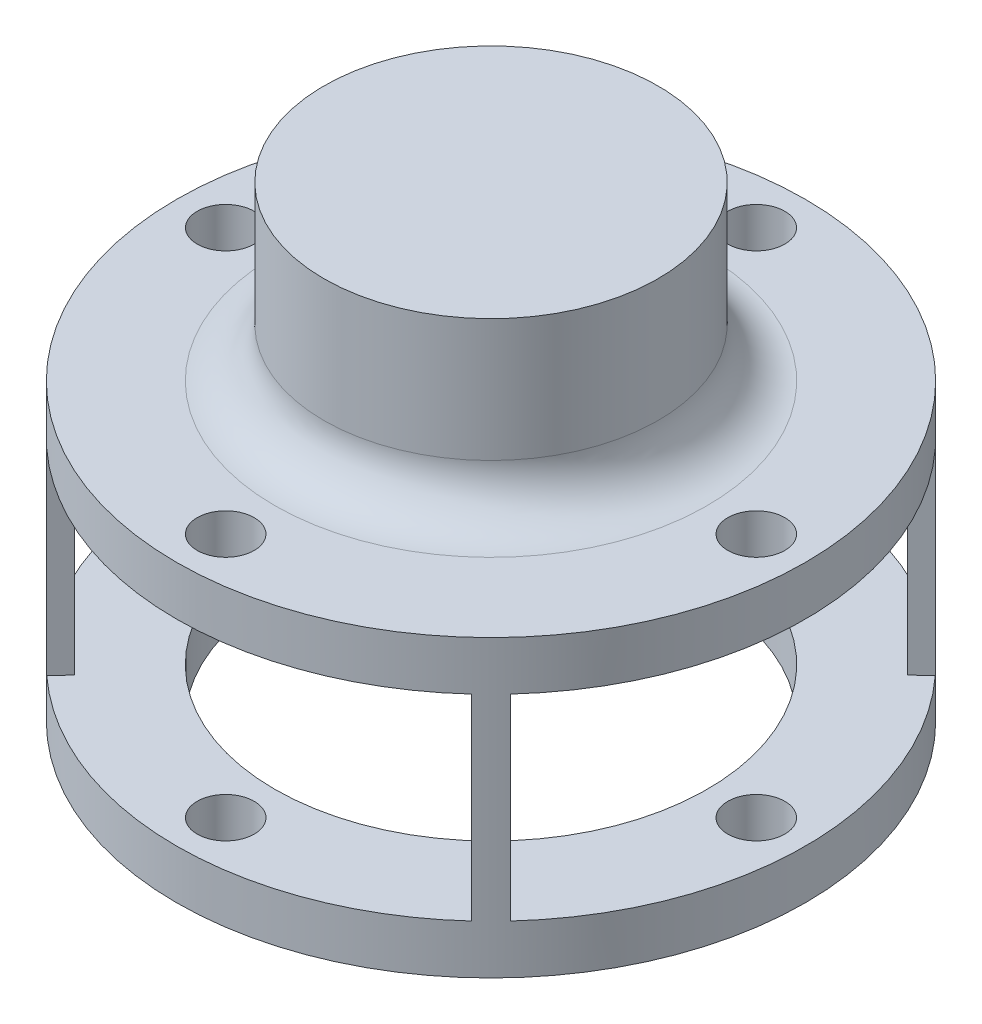
ISO-10303-21;
HEADER;
FILE_DESCRIPTION(('STEP AP214'),'2;1');
FILE_NAME('part.step','',(''),(''),'','','');
FILE_SCHEMA(('AUTOMOTIVE_DESIGN { 1 0 10303 214 1 1 1 1 }'));
ENDSEC;
DATA;
#1=APPLICATION_CONTEXT('core data for automotive mechanical design processes');
#2=APPLICATION_PROTOCOL_DEFINITION('international standard','automotive_design',2000,#1);
#3=PRODUCT_CONTEXT('',#1,'mechanical');
#4=PRODUCT('Part','Part','',(#3));
#5=PRODUCT_RELATED_PRODUCT_CATEGORY('part','',(#4));
#6=PRODUCT_DEFINITION_FORMATION('','',#4);
#7=PRODUCT_DEFINITION_CONTEXT('part definition',#1,'design');
#8=PRODUCT_DEFINITION('design','',#6,#7);
#9=PRODUCT_DEFINITION_SHAPE('','',#8);
#10=(LENGTH_UNIT() NAMED_UNIT(*) SI_UNIT(.MILLI.,.METRE.));
#11=(NAMED_UNIT(*) PLANE_ANGLE_UNIT() SI_UNIT($,.RADIAN.));
#12=(NAMED_UNIT(*) SI_UNIT($,.STERADIAN.) SOLID_ANGLE_UNIT());
#13=UNCERTAINTY_MEASURE_WITH_UNIT(LENGTH_MEASURE(1.E-05),#10,'distance_accuracy_value','');
#14=(GEOMETRIC_REPRESENTATION_CONTEXT(3) GLOBAL_UNCERTAINTY_ASSIGNED_CONTEXT((#13)) GLOBAL_UNIT_ASSIGNED_CONTEXT((#10,
#11,#12)) REPRESENTATION_CONTEXT('',''));
#15=CARTESIAN_POINT('',(0.,0.,0.));
#16=DIRECTION('',(0.,0.,1.));
#17=DIRECTION('',(1.,0.,0.));
#18=AXIS2_PLACEMENT_3D('',#15,#16,#17);
#19=CARTESIAN_POINT('',(0.,5.,0.));
#20=DIRECTION('',(0.,1.,0.));
#21=DIRECTION('',(0.,0.,1.));
#22=AXIS2_PLACEMENT_3D('',#19,#20,#21);
#23=PLANE('',#22);
#24=CARTESIAN_POINT('',(0.,5.,0.));
#25=DIRECTION('',(0.,1.,0.));
#26=DIRECTION('',(0.,0.,1.));
#27=AXIS2_PLACEMENT_3D('',#24,#25,#26);
#28=CIRCLE('',#27,22.);
#29=CARTESIAN_POINT('',(0.,5.,22.));
#30=VERTEX_POINT('',#29);
#31=EDGE_CURVE('E419',#30,#30,#28,.F.);
#32=ORIENTED_EDGE('',*,*,#31,.T.);
#33=EDGE_LOOP('',(#32));
#34=FACE_BOUND('',#33,.T.);
#35=CARTESIAN_POINT('',(27.,5.,0.));
#36=DIRECTION('',(0.,1.,0.));
#37=DIRECTION('',(0.,0.,1.));
#38=AXIS2_PLACEMENT_3D('',#35,#36,#37);
#39=CIRCLE('',#38,2.9);
#40=CARTESIAN_POINT('',(27.,5.,2.9));
#41=VERTEX_POINT('',#40);
#42=EDGE_CURVE('E374',#41,#41,#39,.F.);
#43=ORIENTED_EDGE('',*,*,#42,.T.);
#44=EDGE_LOOP('',(#43));
#45=FACE_BOUND('',#44,.T.);
#46=CARTESIAN_POINT('',(-1.88539992297529E-13,5.,27.));
#47=DIRECTION('',(0.,1.,0.));
#48=DIRECTION('',(0.,0.,1.));
#49=AXIS2_PLACEMENT_3D('',#46,#47,#48);
#50=CIRCLE('',#49,2.9);
#51=CARTESIAN_POINT('',(-1.88539992297529E-13,5.,29.9));
#52=VERTEX_POINT('',#51);
#53=EDGE_CURVE('E385',#52,#52,#50,.F.);
#54=ORIENTED_EDGE('',*,*,#53,.T.);
#55=EDGE_LOOP('',(#54));
#56=FACE_BOUND('',#55,.T.);
#57=CARTESIAN_POINT('',(0.,5.,-27.));
#58=DIRECTION('',(0.,1.,0.));
#59=DIRECTION('',(0.,0.,1.));
#60=AXIS2_PLACEMENT_3D('',#57,#58,#59);
#61=CIRCLE('',#60,2.9);
#62=CARTESIAN_POINT('',(0.,5.,-24.1));
#63=VERTEX_POINT('',#62);
#64=EDGE_CURVE('E393',#63,#63,#61,.F.);
#65=ORIENTED_EDGE('',*,*,#64,.T.);
#66=EDGE_LOOP('',(#65));
#67=FACE_BOUND('',#66,.T.);
#68=CARTESIAN_POINT('',(-27.,5.,-2.82809988446294E-13));
#69=DIRECTION('',(0.,1.,0.));
#70=DIRECTION('',(0.,0.,1.));
#71=AXIS2_PLACEMENT_3D('',#68,#69,#70);
#72=CIRCLE('',#71,2.9);
#73=CARTESIAN_POINT('',(-27.,5.,2.89999999999972));
#74=VERTEX_POINT('',#73);
#75=EDGE_CURVE('E401',#74,#74,#72,.F.);
#76=ORIENTED_EDGE('',*,*,#75,.T.);
#77=EDGE_LOOP('',(#76));
#78=FACE_BOUND('',#77,.T.);
#79=CARTESIAN_POINT('',(0.,5.,0.));
#80=DIRECTION('',(0.,1.,0.));
#81=DIRECTION('',(0.,0.,1.));
#82=AXIS2_PLACEMENT_3D('',#79,#80,#81);
#83=CIRCLE('',#82,32.);
#84=CARTESIAN_POINT('',(-21.6188866437012,5.,23.5928747779239));
#85=VERTEX_POINT('',#84);
#86=CARTESIAN_POINT('',(21.6188866437013,5.,23.5928747779238));
#87=VERTEX_POINT('',#86);
#88=EDGE_CURVE('E252',#85,#87,#83,.T.);
#89=ORIENTED_EDGE('',*,*,#88,.T.);
#90=DIRECTION('',(-0.675590207615662,0.,-0.737277336810122));
#91=VECTOR('',#90,1.);
#92=CARTESIAN_POINT('',(21.6188866437013,5.,23.5928747779239));
#93=LINE('',#92,#91);
#94=CARTESIAN_POINT('',(20.2677062284699,5.,22.1183201043036));
#95=VERTEX_POINT('',#94);
#96=EDGE_CURVE('E69',#87,#95,#93,.T.);
#97=ORIENTED_EDGE('',*,*,#96,.T.);
#98=CARTESIAN_POINT('',(0.,5.,0.));
#99=DIRECTION('',(0.,-1.,0.));
#100=DIRECTION('',(0.,0.,-1.));
#101=AXIS2_PLACEMENT_3D('',#98,#99,#100);
#102=CIRCLE('',#101,30.);
#103=CARTESIAN_POINT('',(22.1183201043037,5.,20.2677062284698));
#104=VERTEX_POINT('',#103);
#105=EDGE_CURVE('E300',#104,#95,#102,.T.);
#106=ORIENTED_EDGE('',*,*,#105,.F.);
#107=DIRECTION('',(-0.737277336810122,0.,-0.675590207615662));
#108=VECTOR('',#107,1.);
#109=CARTESIAN_POINT('',(23.592874777924,5.,21.6188866437012));
#110=LINE('',#109,#108);
#111=CARTESIAN_POINT('',(23.5928747779239,5.,21.6188866437012));
#112=VERTEX_POINT('',#111);
#113=EDGE_CURVE('E212',#112,#104,#110,.T.);
#114=ORIENTED_EDGE('',*,*,#113,.F.);
#115=CARTESIAN_POINT('',(23.5928747779238,5.,-21.6188866437013));
#116=VERTEX_POINT('',#115);
#117=EDGE_CURVE('E186',#112,#116,#83,.T.);
#118=ORIENTED_EDGE('',*,*,#117,.T.);
#119=DIRECTION('',(-0.737277336810122,0.,0.675590207615663));
#120=VECTOR('',#119,1.);
#121=CARTESIAN_POINT('',(23.5928747779238,5.,-21.6188866437013));
#122=LINE('',#121,#120);
#123=CARTESIAN_POINT('',(22.1183201043035,5.,-20.26770622847));
#124=VERTEX_POINT('',#123);
#125=EDGE_CURVE('E76',#116,#124,#122,.T.);
#126=ORIENTED_EDGE('',*,*,#125,.T.);
#127=CARTESIAN_POINT('',(0.,5.,0.));
#128=DIRECTION('',(0.,-1.,0.));
#129=DIRECTION('',(0.,0.,-1.));
#130=AXIS2_PLACEMENT_3D('',#127,#128,#129);
#131=CIRCLE('',#130,30.);
#132=CARTESIAN_POINT('',(20.2677062284697,5.,-22.1183201043038));
#133=VERTEX_POINT('',#132);
#134=EDGE_CURVE('E327',#133,#124,#131,.T.);
#135=ORIENTED_EDGE('',*,*,#134,.F.);
#136=DIRECTION('',(-0.675590207615661,0.,0.737277336810123));
#137=VECTOR('',#136,1.);
#138=CARTESIAN_POINT('',(21.6188866437011,5.,-23.592874777924));
#139=LINE('',#138,#137);
#140=CARTESIAN_POINT('',(21.6188866437011,5.,-23.592874777924));
#141=VERTEX_POINT('',#140);
#142=EDGE_CURVE('E316',#141,#133,#139,.T.);
#143=ORIENTED_EDGE('',*,*,#142,.F.);
#144=CARTESIAN_POINT('',(-21.6188866437014,5.,-23.5928747779237));
#145=VERTEX_POINT('',#144);
#146=EDGE_CURVE('E263',#141,#145,#83,.T.);
#147=ORIENTED_EDGE('',*,*,#146,.T.);
#148=DIRECTION('',(0.675590207615667,0.,0.737277336810118));
#149=VECTOR('',#148,1.);
#150=CARTESIAN_POINT('',(-21.6188866437014,5.,-23.5928747779237));
#151=LINE('',#150,#149);
#152=CARTESIAN_POINT('',(-20.2677062284701,5.,-22.1183201043035));
#153=VERTEX_POINT('',#152);
#154=EDGE_CURVE('E229',#145,#153,#151,.T.);
#155=ORIENTED_EDGE('',*,*,#154,.T.);
#156=CARTESIAN_POINT('',(0.,5.,0.));
#157=DIRECTION('',(0.,-1.,0.));
#158=DIRECTION('',(0.,0.,-1.));
#159=AXIS2_PLACEMENT_3D('',#156,#157,#158);
#160=CIRCLE('',#159,30.);
#161=CARTESIAN_POINT('',(-22.1183201043038,5.,-20.2677062284697));
#162=VERTEX_POINT('',#161);
#163=EDGE_CURVE('E355',#162,#153,#160,.T.);
#164=ORIENTED_EDGE('',*,*,#163,.F.);
#165=DIRECTION('',(0.737277336810126,0.,0.675590207615658));
#166=VECTOR('',#165,1.);
#167=CARTESIAN_POINT('',(-23.5928747779241,5.,-21.618886643701));
#168=LINE('',#167,#166);
#169=CARTESIAN_POINT('',(-23.5928747779241,5.,-21.618886643701));
#170=VERTEX_POINT('',#169);
#171=EDGE_CURVE('E271',#170,#162,#168,.T.);
#172=ORIENTED_EDGE('',*,*,#171,.F.);
#173=CARTESIAN_POINT('',(-23.5928747779239,5.,21.6188866437012));
#174=VERTEX_POINT('',#173);
#175=EDGE_CURVE('E255',#170,#174,#83,.T.);
#176=ORIENTED_EDGE('',*,*,#175,.T.);
#177=DIRECTION('',(0.737277336810125,0.,-0.67559020761566));
#178=VECTOR('',#177,1.);
#179=CARTESIAN_POINT('',(-23.5928747779239,5.,21.6188866437012));
#180=LINE('',#179,#178);
#181=CARTESIAN_POINT('',(-22.1183201043037,5.,20.2677062284699));
#182=VERTEX_POINT('',#181);
#183=EDGE_CURVE('E225',#174,#182,#180,.T.);
#184=ORIENTED_EDGE('',*,*,#183,.T.);
#185=CARTESIAN_POINT('',(0.,5.,0.));
#186=DIRECTION('',(0.,-1.,0.));
#187=DIRECTION('',(0.,0.,-1.));
#188=AXIS2_PLACEMENT_3D('',#185,#186,#187);
#189=CIRCLE('',#188,30.);
#190=CARTESIAN_POINT('',(-20.2677062284699,5.,22.1183201043036));
#191=VERTEX_POINT('',#190);
#192=EDGE_CURVE('E228',#191,#182,#189,.T.);
#193=ORIENTED_EDGE('',*,*,#192,.F.);
#194=DIRECTION('',(0.675590207615665,0.,-0.73727733681012));
#195=VECTOR('',#194,1.);
#196=CARTESIAN_POINT('',(-21.6188866437012,5.,23.5928747779239));
#197=LINE('',#196,#195);
#198=EDGE_CURVE('E218',#85,#191,#197,.T.);
#199=ORIENTED_EDGE('',*,*,#198,.F.);
#200=EDGE_LOOP('',(#89,#97,#106,#114,#118,#126,#135,#143,#147,#155,#164,#172,#176,#184,#193,#199));
#201=FACE_BOUND('',#200,.T.);
#202=ADVANCED_FACE('F53',(#34,#45,#56,#67,#78,#201),#23,.T.);
#203=CARTESIAN_POINT('',(0.,5.,0.));
#204=DIRECTION('',(0.,-1.,0.));
#205=DIRECTION('',(0.,0.,-1.));
#206=AXIS2_PLACEMENT_3D('',#203,#204,#205);
#207=CYLINDRICAL_SURFACE('',#206,32.);
#208=CARTESIAN_POINT('',(0.,25.,0.));
#209=DIRECTION('',(0.,1.,0.));
#210=DIRECTION('',(0.,0.,1.));
#211=AXIS2_PLACEMENT_3D('',#208,#209,#210);
#212=CIRCLE('',#211,32.);
#213=CARTESIAN_POINT('',(-23.5928747779241,25.,-21.618886643701));
#214=VERTEX_POINT('',#213);
#215=CARTESIAN_POINT('',(-23.5928747779239,25.,21.6188866437012));
#216=VERTEX_POINT('',#215);
#217=EDGE_CURVE('E277',#214,#216,#212,.T.);
#218=ORIENTED_EDGE('',*,*,#217,.T.);
#219=DIRECTION('',(0.,-1.,0.));
#220=VECTOR('',#219,1.);
#221=CARTESIAN_POINT('',(-23.5928747779239,25.,21.6188866437012));
#222=LINE('',#221,#220);
#223=EDGE_CURVE('E224',#216,#174,#222,.T.);
#224=ORIENTED_EDGE('',*,*,#223,.T.);
#225=ORIENTED_EDGE('',*,*,#175,.F.);
#226=DIRECTION('',(0.,-1.,0.));
#227=VECTOR('',#226,1.);
#228=CARTESIAN_POINT('',(-23.5928747779241,25.,-21.618886643701));
#229=LINE('',#228,#227);
#230=EDGE_CURVE('E326',#214,#170,#229,.T.);
#231=ORIENTED_EDGE('',*,*,#230,.F.);
#232=EDGE_LOOP('',(#218,#224,#225,#231));
#233=FACE_BOUND('',#232,.T.);
#234=CARTESIAN_POINT('',(21.6188866437011,25.,-23.592874777924));
#235=VERTEX_POINT('',#234);
#236=CARTESIAN_POINT('',(-21.6188866437014,25.,-23.5928747779237));
#237=VERTEX_POINT('',#236);
#238=EDGE_CURVE('E178',#235,#237,#212,.T.);
#239=ORIENTED_EDGE('',*,*,#238,.T.);
#240=DIRECTION('',(0.,-1.,0.));
#241=VECTOR('',#240,1.);
#242=CARTESIAN_POINT('',(-21.6188866437014,25.,-23.5928747779237));
#243=LINE('',#242,#241);
#244=EDGE_CURVE('E352',#237,#145,#243,.T.);
#245=ORIENTED_EDGE('',*,*,#244,.T.);
#246=ORIENTED_EDGE('',*,*,#146,.F.);
#247=DIRECTION('',(0.,-1.,0.));
#248=VECTOR('',#247,1.);
#249=CARTESIAN_POINT('',(21.6188866437011,25.,-23.592874777924));
#250=LINE('',#249,#248);
#251=EDGE_CURVE('E299',#235,#141,#250,.T.);
#252=ORIENTED_EDGE('',*,*,#251,.F.);
#253=EDGE_LOOP('',(#239,#245,#246,#252));
#254=FACE_BOUND('',#253,.T.);
#255=CARTESIAN_POINT('',(23.5928747779239,25.,21.6188866437012));
#256=VERTEX_POINT('',#255);
#257=CARTESIAN_POINT('',(23.5928747779238,25.,-21.6188866437013));
#258=VERTEX_POINT('',#257);
#259=EDGE_CURVE('E165',#256,#258,#212,.T.);
#260=ORIENTED_EDGE('',*,*,#259,.T.);
#261=DIRECTION('',(0.,-1.,0.));
#262=VECTOR('',#261,1.);
#263=CARTESIAN_POINT('',(23.5928747779238,25.,-21.6188866437013));
#264=LINE('',#263,#262);
#265=EDGE_CURVE('E323',#258,#116,#264,.T.);
#266=ORIENTED_EDGE('',*,*,#265,.T.);
#267=ORIENTED_EDGE('',*,*,#117,.F.);
#268=DIRECTION('',(0.,-1.,0.));
#269=VECTOR('',#268,1.);
#270=CARTESIAN_POINT('',(23.592874777924,25.,21.6188866437012));
#271=LINE('',#270,#269);
#272=EDGE_CURVE('E183',#256,#112,#271,.T.);
#273=ORIENTED_EDGE('',*,*,#272,.F.);
#274=EDGE_LOOP('',(#260,#266,#267,#273));
#275=FACE_BOUND('',#274,.T.);
#276=DIRECTION('',(0.,-1.,0.));
#277=VECTOR('',#276,1.);
#278=CARTESIAN_POINT('',(-21.6188866437012,25.,23.5928747779239));
#279=LINE('',#278,#277);
#280=CARTESIAN_POINT('',(-21.6188866437012,25.,23.5928747779239));
#281=VERTEX_POINT('',#280);
#282=EDGE_CURVE('E236',#281,#85,#279,.T.);
#283=ORIENTED_EDGE('',*,*,#282,.F.);
#284=CARTESIAN_POINT('',(21.6188866437013,25.,23.5928747779239));
#285=VERTEX_POINT('',#284);
#286=EDGE_CURVE('E180',#281,#285,#212,.T.);
#287=ORIENTED_EDGE('',*,*,#286,.T.);
#288=DIRECTION('',(0.,-1.,0.));
#289=VECTOR('',#288,1.);
#290=CARTESIAN_POINT('',(21.6188866437013,25.,23.5928747779239));
#291=LINE('',#290,#289);
#292=EDGE_CURVE('E197',#285,#87,#291,.T.);
#293=ORIENTED_EDGE('',*,*,#292,.T.);
#294=ORIENTED_EDGE('',*,*,#88,.F.);
#295=EDGE_LOOP('',(#283,#287,#293,#294));
#296=FACE_BOUND('',#295,.T.);
#297=CARTESIAN_POINT('',(0.,0.,0.));
#298=DIRECTION('',(0.,1.,0.));
#299=DIRECTION('',(0.,0.,1.));
#300=AXIS2_PLACEMENT_3D('',#297,#298,#299);
#301=CIRCLE('',#300,32.);
#302=CARTESIAN_POINT('',(0.,0.,32.));
#303=VERTEX_POINT('',#302);
#304=EDGE_CURVE('E240',#303,#303,#301,.T.);
#305=ORIENTED_EDGE('',*,*,#304,.T.);
#306=EDGE_LOOP('',(#305));
#307=FACE_BOUND('',#306,.T.);
#308=CARTESIAN_POINT('',(0.,30.,0.));
#309=DIRECTION('',(0.,1.,0.));
#310=DIRECTION('',(0.,0.,1.));
#311=AXIS2_PLACEMENT_3D('',#308,#309,#310);
#312=CIRCLE('',#311,32.);
#313=CARTESIAN_POINT('',(0.,30.,32.));
#314=VERTEX_POINT('',#313);
#315=EDGE_CURVE('E177',#314,#314,#312,.T.);
#316=ORIENTED_EDGE('',*,*,#315,.F.);
#317=EDGE_LOOP('',(#316));
#318=FACE_BOUND('',#317,.T.);
#319=ADVANCED_FACE('F184',(#233,#254,#275,#296,#307,#318),#207,.T.);
#320=CARTESIAN_POINT('',(0.,0.,0.));
#321=DIRECTION('',(0.,1.,0.));
#322=DIRECTION('',(0.,0.,1.));
#323=AXIS2_PLACEMENT_3D('',#320,#321,#322);
#324=PLANE('',#323);
#325=CARTESIAN_POINT('',(0.,0.,0.));
#326=DIRECTION('',(0.,1.,0.));
#327=DIRECTION('',(0.,0.,1.));
#328=AXIS2_PLACEMENT_3D('',#325,#326,#327);
#329=CIRCLE('',#328,22.);
#330=CARTESIAN_POINT('',(0.,0.,22.));
#331=VERTEX_POINT('',#330);
#332=EDGE_CURVE('E445',#331,#331,#329,.T.);
#333=ORIENTED_EDGE('',*,*,#332,.T.);
#334=EDGE_LOOP('',(#333));
#335=FACE_BOUND('',#334,.T.);
#336=CARTESIAN_POINT('',(27.,0.,0.));
#337=DIRECTION('',(0.,1.,0.));
#338=DIRECTION('',(0.,0.,1.));
#339=AXIS2_PLACEMENT_3D('',#336,#337,#338);
#340=CIRCLE('',#339,2.9);
#341=CARTESIAN_POINT('',(27.,0.,2.9));
#342=VERTEX_POINT('',#341);
#343=EDGE_CURVE('E432',#342,#342,#340,.T.);
#344=ORIENTED_EDGE('',*,*,#343,.T.);
#345=EDGE_LOOP('',(#344));
#346=FACE_BOUND('',#345,.T.);
#347=CARTESIAN_POINT('',(-1.88539992297529E-13,0.,27.));
#348=DIRECTION('',(0.,1.,0.));
#349=DIRECTION('',(0.,0.,1.));
#350=AXIS2_PLACEMENT_3D('',#347,#348,#349);
#351=CIRCLE('',#350,2.9);
#352=CARTESIAN_POINT('',(-1.88539992297529E-13,0.,29.9));
#353=VERTEX_POINT('',#352);
#354=EDGE_CURVE('E428',#353,#353,#351,.T.);
#355=ORIENTED_EDGE('',*,*,#354,.T.);
#356=EDGE_LOOP('',(#355));
#357=FACE_BOUND('',#356,.T.);
#358=CARTESIAN_POINT('',(0.,0.,-27.));
#359=DIRECTION('',(0.,1.,0.));
#360=DIRECTION('',(0.,0.,1.));
#361=AXIS2_PLACEMENT_3D('',#358,#359,#360);
#362=CIRCLE('',#361,2.9);
#363=CARTESIAN_POINT('',(0.,0.,-24.1));
#364=VERTEX_POINT('',#363);
#365=EDGE_CURVE('E420',#364,#364,#362,.T.);
#366=ORIENTED_EDGE('',*,*,#365,.T.);
#367=EDGE_LOOP('',(#366));
#368=FACE_BOUND('',#367,.T.);
#369=CARTESIAN_POINT('',(-27.,0.,-2.82809988446294E-13));
#370=DIRECTION('',(0.,1.,0.));
#371=DIRECTION('',(0.,0.,1.));
#372=AXIS2_PLACEMENT_3D('',#369,#370,#371);
#373=CIRCLE('',#372,2.9);
#374=CARTESIAN_POINT('',(-27.,0.,2.89999999999972));
#375=VERTEX_POINT('',#374);
#376=EDGE_CURVE('E410',#375,#375,#373,.T.);
#377=ORIENTED_EDGE('',*,*,#376,.T.);
#378=EDGE_LOOP('',(#377));
#379=FACE_BOUND('',#378,.T.);
#380=ORIENTED_EDGE('',*,*,#304,.F.);
#381=EDGE_LOOP('',(#380));
#382=FACE_BOUND('',#381,.T.);
#383=ADVANCED_FACE('F478',(#335,#346,#357,#368,#379,#382),#324,.F.);
#384=CARTESIAN_POINT('',(-21.6188866437012,25.,23.5928747779239));
#385=DIRECTION('',(-0.73727733681012,0.,-0.675590207615665));
#386=DIRECTION('',(-0.675590207615665,0.,0.73727733681012));
#387=AXIS2_PLACEMENT_3D('',#384,#385,#386);
#388=PLANE('',#387);
#389=ORIENTED_EDGE('',*,*,#198,.T.);
#390=DIRECTION('',(0.,-1.,0.));
#391=VECTOR('',#390,1.);
#392=CARTESIAN_POINT('',(-20.2677062284699,25.,22.1183201043036));
#393=LINE('',#392,#391);
#394=CARTESIAN_POINT('',(-20.2677062284699,25.,22.1183201043036));
#395=VERTEX_POINT('',#394);
#396=EDGE_CURVE('E241',#395,#191,#393,.T.);
#397=ORIENTED_EDGE('',*,*,#396,.F.);
#398=DIRECTION('',(0.675590207615665,0.,-0.73727733681012));
#399=VECTOR('',#398,1.);
#400=CARTESIAN_POINT('',(-21.6188866437012,25.,23.5928747779239));
#401=LINE('',#400,#399);
#402=EDGE_CURVE('E221',#281,#395,#401,.T.);
#403=ORIENTED_EDGE('',*,*,#402,.F.);
#404=ORIENTED_EDGE('',*,*,#282,.T.);
#405=EDGE_LOOP('',(#389,#397,#403,#404));
#406=FACE_BOUND('',#405,.T.);
#407=ADVANCED_FACE('F288',(#406),#388,.F.);
#408=CARTESIAN_POINT('',(0.,25.,0.));
#409=DIRECTION('',(0.,-1.,0.));
#410=DIRECTION('',(0.,0.,-1.));
#411=AXIS2_PLACEMENT_3D('',#408,#409,#410);
#412=CYLINDRICAL_SURFACE('',#411,30.);
#413=ORIENTED_EDGE('',*,*,#192,.T.);
#414=DIRECTION('',(0.,-1.,0.));
#415=VECTOR('',#414,1.);
#416=CARTESIAN_POINT('',(-22.1183201043037,25.,20.2677062284699));
#417=LINE('',#416,#415);
#418=CARTESIAN_POINT('',(-22.1183201043037,25.,20.2677062284699));
#419=VERTEX_POINT('',#418);
#420=EDGE_CURVE('E245',#419,#182,#417,.T.);
#421=ORIENTED_EDGE('',*,*,#420,.F.);
#422=CARTESIAN_POINT('',(0.,25.,0.));
#423=DIRECTION('',(0.,-1.,0.));
#424=DIRECTION('',(0.,0.,-1.));
#425=AXIS2_PLACEMENT_3D('',#422,#423,#424);
#426=CIRCLE('',#425,30.);
#427=EDGE_CURVE('E217',#395,#419,#426,.T.);
#428=ORIENTED_EDGE('',*,*,#427,.F.);
#429=ORIENTED_EDGE('',*,*,#396,.T.);
#430=EDGE_LOOP('',(#413,#421,#428,#429));
#431=FACE_BOUND('',#430,.T.);
#432=ADVANCED_FACE('F284',(#431),#412,.F.);
#433=CARTESIAN_POINT('',(-23.5928747779239,25.,21.6188866437012));
#434=DIRECTION('',(-0.67559020761566,0.,-0.737277336810125));
#435=DIRECTION('',(-0.737277336810125,0.,0.67559020761566));
#436=AXIS2_PLACEMENT_3D('',#433,#434,#435);
#437=PLANE('',#436);
#438=ORIENTED_EDGE('',*,*,#183,.F.);
#439=ORIENTED_EDGE('',*,*,#223,.F.);
#440=DIRECTION('',(0.737277336810125,0.,-0.67559020761566));
#441=VECTOR('',#440,1.);
#442=CARTESIAN_POINT('',(-23.5928747779239,25.,21.6188866437012));
#443=LINE('',#442,#441);
#444=EDGE_CURVE('E213',#216,#419,#443,.T.);
#445=ORIENTED_EDGE('',*,*,#444,.T.);
#446=ORIENTED_EDGE('',*,*,#420,.T.);
#447=EDGE_LOOP('',(#438,#439,#445,#446));
#448=FACE_BOUND('',#447,.T.);
#449=ADVANCED_FACE('F280',(#448),#437,.T.);
#450=CARTESIAN_POINT('',(-23.5928747779241,25.,-21.618886643701));
#451=DIRECTION('',(0.675590207615658,0.,-0.737277336810126));
#452=DIRECTION('',(-0.737277336810126,0.,-0.675590207615658));
#453=AXIS2_PLACEMENT_3D('',#450,#451,#452);
#454=PLANE('',#453);
#455=ORIENTED_EDGE('',*,*,#171,.T.);
#456=DIRECTION('',(0.,-1.,0.));
#457=VECTOR('',#456,1.);
#458=CARTESIAN_POINT('',(-22.1183201043038,25.,-20.2677062284697));
#459=LINE('',#458,#457);
#460=CARTESIAN_POINT('',(-22.1183201043038,25.,-20.2677062284697));
#461=VERTEX_POINT('',#460);
#462=EDGE_CURVE('E363',#461,#162,#459,.T.);
#463=ORIENTED_EDGE('',*,*,#462,.F.);
#464=DIRECTION('',(0.737277336810126,0.,0.675590207615658));
#465=VECTOR('',#464,1.);
#466=CARTESIAN_POINT('',(-23.5928747779241,25.,-21.618886643701));
#467=LINE('',#466,#465);
#468=EDGE_CURVE('E349',#214,#461,#467,.T.);
#469=ORIENTED_EDGE('',*,*,#468,.F.);
#470=ORIENTED_EDGE('',*,*,#230,.T.);
#471=EDGE_LOOP('',(#455,#463,#469,#470));
#472=FACE_BOUND('',#471,.T.);
#473=ADVANCED_FACE('F527',(#472),#454,.F.);
#474=CARTESIAN_POINT('',(0.,25.,0.));
#475=DIRECTION('',(0.,-1.,0.));
#476=DIRECTION('',(0.,0.,-1.));
#477=AXIS2_PLACEMENT_3D('',#474,#475,#476);
#478=CYLINDRICAL_SURFACE('',#477,30.);
#479=ORIENTED_EDGE('',*,*,#163,.T.);
#480=DIRECTION('',(0.,-1.,0.));
#481=VECTOR('',#480,1.);
#482=CARTESIAN_POINT('',(-20.2677062284701,25.,-22.1183201043035));
#483=LINE('',#482,#481);
#484=CARTESIAN_POINT('',(-20.2677062284701,25.,-22.1183201043035));
#485=VERTEX_POINT('',#484);
#486=EDGE_CURVE('E367',#485,#153,#483,.T.);
#487=ORIENTED_EDGE('',*,*,#486,.F.);
#488=CARTESIAN_POINT('',(0.,25.,0.));
#489=DIRECTION('',(0.,-1.,0.));
#490=DIRECTION('',(0.,0.,-1.));
#491=AXIS2_PLACEMENT_3D('',#488,#489,#490);
#492=CIRCLE('',#491,30.);
#493=EDGE_CURVE('E346',#461,#485,#492,.T.);
#494=ORIENTED_EDGE('',*,*,#493,.F.);
#495=ORIENTED_EDGE('',*,*,#462,.T.);
#496=EDGE_LOOP('',(#479,#487,#494,#495));
#497=FACE_BOUND('',#496,.T.);
#498=ADVANCED_FACE('F523',(#497),#478,.F.);
#499=CARTESIAN_POINT('',(-21.6188866437014,25.,-23.5928747779237));
#500=DIRECTION('',(0.737277336810118,0.,-0.675590207615667));
#501=DIRECTION('',(-0.675590207615667,0.,-0.737277336810118));
#502=AXIS2_PLACEMENT_3D('',#499,#500,#501);
#503=PLANE('',#502);
#504=ORIENTED_EDGE('',*,*,#154,.F.);
#505=ORIENTED_EDGE('',*,*,#244,.F.);
#506=DIRECTION('',(0.675590207615667,0.,0.737277336810118));
#507=VECTOR('',#506,1.);
#508=CARTESIAN_POINT('',(-21.6188866437014,25.,-23.5928747779237));
#509=LINE('',#508,#507);
#510=EDGE_CURVE('E342',#237,#485,#509,.T.);
#511=ORIENTED_EDGE('',*,*,#510,.T.);
#512=ORIENTED_EDGE('',*,*,#486,.T.);
#513=EDGE_LOOP('',(#504,#505,#511,#512));
#514=FACE_BOUND('',#513,.T.);
#515=ADVANCED_FACE('F519',(#514),#503,.T.);
#516=CARTESIAN_POINT('',(21.6188866437011,25.,-23.592874777924));
#517=DIRECTION('',(0.737277336810123,0.,0.675590207615661));
#518=DIRECTION('',(0.675590207615661,0.,-0.737277336810123));
#519=AXIS2_PLACEMENT_3D('',#516,#517,#518);
#520=PLANE('',#519);
#521=ORIENTED_EDGE('',*,*,#142,.T.);
#522=DIRECTION('',(0.,-1.,0.));
#523=VECTOR('',#522,1.);
#524=CARTESIAN_POINT('',(20.2677062284697,25.,-22.1183201043038));
#525=LINE('',#524,#523);
#526=CARTESIAN_POINT('',(20.2677062284697,25.,-22.1183201043038));
#527=VERTEX_POINT('',#526);
#528=EDGE_CURVE('E304',#527,#133,#525,.T.);
#529=ORIENTED_EDGE('',*,*,#528,.F.);
#530=DIRECTION('',(-0.675590207615661,0.,0.737277336810123));
#531=VECTOR('',#530,1.);
#532=CARTESIAN_POINT('',(21.6188866437011,25.,-23.592874777924));
#533=LINE('',#532,#531);
#534=EDGE_CURVE('E320',#235,#527,#533,.T.);
#535=ORIENTED_EDGE('',*,*,#534,.F.);
#536=ORIENTED_EDGE('',*,*,#251,.T.);
#537=EDGE_LOOP('',(#521,#529,#535,#536));
#538=FACE_BOUND('',#537,.T.);
#539=ADVANCED_FACE('F522',(#538),#520,.F.);
#540=CARTESIAN_POINT('',(0.,25.,0.));
#541=DIRECTION('',(0.,-1.,0.));
#542=DIRECTION('',(0.,0.,-1.));
#543=AXIS2_PLACEMENT_3D('',#540,#541,#542);
#544=CYLINDRICAL_SURFACE('',#543,30.);
#545=ORIENTED_EDGE('',*,*,#134,.T.);
#546=DIRECTION('',(0.,-1.,0.));
#547=VECTOR('',#546,1.);
#548=CARTESIAN_POINT('',(22.1183201043035,25.,-20.26770622847));
#549=LINE('',#548,#547);
#550=CARTESIAN_POINT('',(22.1183201043035,25.,-20.26770622847));
#551=VERTEX_POINT('',#550);
#552=EDGE_CURVE('E337',#551,#124,#549,.T.);
#553=ORIENTED_EDGE('',*,*,#552,.F.);
#554=CARTESIAN_POINT('',(0.,25.,0.));
#555=DIRECTION('',(0.,-1.,0.));
#556=DIRECTION('',(0.,0.,-1.));
#557=AXIS2_PLACEMENT_3D('',#554,#555,#556);
#558=CIRCLE('',#557,30.);
#559=EDGE_CURVE('E317',#527,#551,#558,.T.);
#560=ORIENTED_EDGE('',*,*,#559,.F.);
#561=ORIENTED_EDGE('',*,*,#528,.T.);
#562=EDGE_LOOP('',(#545,#553,#560,#561));
#563=FACE_BOUND('',#562,.T.);
#564=ADVANCED_FACE('F535',(#563),#544,.F.);
#565=CARTESIAN_POINT('',(23.5928747779238,25.,-21.6188866437013));
#566=DIRECTION('',(0.675590207615663,0.,0.737277336810122));
#567=DIRECTION('',(0.737277336810122,0.,-0.675590207615663));
#568=AXIS2_PLACEMENT_3D('',#565,#566,#567);
#569=PLANE('',#568);
#570=ORIENTED_EDGE('',*,*,#125,.F.);
#571=ORIENTED_EDGE('',*,*,#265,.F.);
#572=DIRECTION('',(-0.737277336810122,0.,0.675590207615663));
#573=VECTOR('',#572,1.);
#574=CARTESIAN_POINT('',(23.5928747779238,25.,-21.6188866437013));
#575=LINE('',#574,#573);
#576=EDGE_CURVE('E172',#258,#551,#575,.T.);
#577=ORIENTED_EDGE('',*,*,#576,.T.);
#578=ORIENTED_EDGE('',*,*,#552,.T.);
#579=EDGE_LOOP('',(#570,#571,#577,#578));
#580=FACE_BOUND('',#579,.T.);
#581=ADVANCED_FACE('F532',(#580),#569,.T.);
#582=CARTESIAN_POINT('',(23.592874777924,25.,21.6188866437012));
#583=DIRECTION('',(-0.675590207615662,0.,0.737277336810122));
#584=DIRECTION('',(0.737277336810122,0.,0.675590207615662));
#585=AXIS2_PLACEMENT_3D('',#582,#583,#584);
#586=PLANE('',#585);
#587=ORIENTED_EDGE('',*,*,#113,.T.);
#588=DIRECTION('',(0.,-1.,0.));
#589=VECTOR('',#588,1.);
#590=CARTESIAN_POINT('',(22.1183201043037,25.,20.2677062284698));
#591=LINE('',#590,#589);
#592=CARTESIAN_POINT('',(22.1183201043037,25.,20.2677062284698));
#593=VERTEX_POINT('',#592);
#594=EDGE_CURVE('E190',#593,#104,#591,.T.);
#595=ORIENTED_EDGE('',*,*,#594,.F.);
#596=DIRECTION('',(-0.737277336810122,0.,-0.675590207615662));
#597=VECTOR('',#596,1.);
#598=CARTESIAN_POINT('',(23.592874777924,25.,21.6188866437012));
#599=LINE('',#598,#597);
#600=EDGE_CURVE('E169',#256,#593,#599,.T.);
#601=ORIENTED_EDGE('',*,*,#600,.F.);
#602=ORIENTED_EDGE('',*,*,#272,.T.);
#603=EDGE_LOOP('',(#587,#595,#601,#602));
#604=FACE_BOUND('',#603,.T.);
#605=ADVANCED_FACE('F192',(#604),#586,.F.);
#606=CARTESIAN_POINT('',(0.,25.,0.));
#607=DIRECTION('',(0.,-1.,0.));
#608=DIRECTION('',(0.,0.,-1.));
#609=AXIS2_PLACEMENT_3D('',#606,#607,#608);
#610=CYLINDRICAL_SURFACE('',#609,30.);
#611=ORIENTED_EDGE('',*,*,#105,.T.);
#612=DIRECTION('',(0.,-1.,0.));
#613=VECTOR('',#612,1.);
#614=CARTESIAN_POINT('',(20.2677062284699,25.,22.1183201043036));
#615=LINE('',#614,#613);
#616=CARTESIAN_POINT('',(20.2677062284699,25.,22.1183201043036));
#617=VERTEX_POINT('',#616);
#618=EDGE_CURVE('E204',#617,#95,#615,.T.);
#619=ORIENTED_EDGE('',*,*,#618,.F.);
#620=CARTESIAN_POINT('',(0.,25.,0.));
#621=DIRECTION('',(0.,-1.,0.));
#622=DIRECTION('',(0.,0.,-1.));
#623=AXIS2_PLACEMENT_3D('',#620,#621,#622);
#624=CIRCLE('',#623,30.);
#625=EDGE_CURVE('E196',#593,#617,#624,.T.);
#626=ORIENTED_EDGE('',*,*,#625,.F.);
#627=ORIENTED_EDGE('',*,*,#594,.T.);
#628=EDGE_LOOP('',(#611,#619,#626,#627));
#629=FACE_BOUND('',#628,.T.);
#630=ADVANCED_FACE('F545',(#629),#610,.F.);
#631=CARTESIAN_POINT('',(21.6188866437013,25.,23.5928747779239));
#632=DIRECTION('',(-0.737277336810122,0.,0.675590207615662));
#633=DIRECTION('',(0.675590207615662,0.,0.737277336810122));
#634=AXIS2_PLACEMENT_3D('',#631,#632,#633);
#635=PLANE('',#634);
#636=ORIENTED_EDGE('',*,*,#96,.F.);
#637=ORIENTED_EDGE('',*,*,#292,.F.);
#638=DIRECTION('',(-0.675590207615662,0.,-0.737277336810122));
#639=VECTOR('',#638,1.);
#640=CARTESIAN_POINT('',(21.6188866437013,25.,23.5928747779239));
#641=LINE('',#640,#639);
#642=EDGE_CURVE('E201',#285,#617,#641,.T.);
#643=ORIENTED_EDGE('',*,*,#642,.T.);
#644=ORIENTED_EDGE('',*,*,#618,.T.);
#645=EDGE_LOOP('',(#636,#637,#643,#644));
#646=FACE_BOUND('',#645,.T.);
#647=ADVANCED_FACE('F295',(#646),#635,.T.);
#648=CARTESIAN_POINT('',(0.,25.,0.));
#649=DIRECTION('',(0.,1.,0.));
#650=DIRECTION('',(0.,0.,1.));
#651=AXIS2_PLACEMENT_3D('',#648,#649,#650);
#652=PLANE('',#651);
#653=CARTESIAN_POINT('',(27.,25.,0.));
#654=DIRECTION('',(0.,1.,0.));
#655=DIRECTION('',(0.,0.,1.));
#656=AXIS2_PLACEMENT_3D('',#653,#654,#655);
#657=CIRCLE('',#656,2.9);
#658=CARTESIAN_POINT('',(27.,25.,2.9));
#659=VERTEX_POINT('',#658);
#660=EDGE_CURVE('E381',#659,#659,#657,.F.);
#661=ORIENTED_EDGE('',*,*,#660,.F.);
#662=EDGE_LOOP('',(#661));
#663=FACE_BOUND('',#662,.T.);
#664=CARTESIAN_POINT('',(-1.88539992297529E-13,25.,27.));
#665=DIRECTION('',(0.,1.,0.));
#666=DIRECTION('',(0.,0.,1.));
#667=AXIS2_PLACEMENT_3D('',#664,#665,#666);
#668=CIRCLE('',#667,2.9);
#669=CARTESIAN_POINT('',(-1.88539992297529E-13,25.,29.9));
#670=VERTEX_POINT('',#669);
#671=EDGE_CURVE('E389',#670,#670,#668,.F.);
#672=ORIENTED_EDGE('',*,*,#671,.F.);
#673=EDGE_LOOP('',(#672));
#674=FACE_BOUND('',#673,.T.);
#675=CARTESIAN_POINT('',(0.,25.,-27.));
#676=DIRECTION('',(0.,1.,0.));
#677=DIRECTION('',(0.,0.,1.));
#678=AXIS2_PLACEMENT_3D('',#675,#676,#677);
#679=CIRCLE('',#678,2.9);
#680=CARTESIAN_POINT('',(0.,25.,-24.1));
#681=VERTEX_POINT('',#680);
#682=EDGE_CURVE('E397',#681,#681,#679,.F.);
#683=ORIENTED_EDGE('',*,*,#682,.F.);
#684=EDGE_LOOP('',(#683));
#685=FACE_BOUND('',#684,.T.);
#686=CARTESIAN_POINT('',(-27.,25.,-2.82809988446294E-13));
#687=DIRECTION('',(0.,1.,0.));
#688=DIRECTION('',(0.,0.,1.));
#689=AXIS2_PLACEMENT_3D('',#686,#687,#688);
#690=CIRCLE('',#689,2.9);
#691=CARTESIAN_POINT('',(-27.,25.,2.89999999999972));
#692=VERTEX_POINT('',#691);
#693=EDGE_CURVE('E405',#692,#692,#690,.F.);
#694=ORIENTED_EDGE('',*,*,#693,.F.);
#695=EDGE_LOOP('',(#694));
#696=FACE_BOUND('',#695,.T.);
#697=ORIENTED_EDGE('',*,*,#286,.F.);
#698=ORIENTED_EDGE('',*,*,#402,.T.);
#699=ORIENTED_EDGE('',*,*,#427,.T.);
#700=ORIENTED_EDGE('',*,*,#444,.F.);
#701=ORIENTED_EDGE('',*,*,#217,.F.);
#702=ORIENTED_EDGE('',*,*,#468,.T.);
#703=ORIENTED_EDGE('',*,*,#493,.T.);
#704=ORIENTED_EDGE('',*,*,#510,.F.);
#705=ORIENTED_EDGE('',*,*,#238,.F.);
#706=ORIENTED_EDGE('',*,*,#534,.T.);
#707=ORIENTED_EDGE('',*,*,#559,.T.);
#708=ORIENTED_EDGE('',*,*,#576,.F.);
#709=ORIENTED_EDGE('',*,*,#259,.F.);
#710=ORIENTED_EDGE('',*,*,#600,.T.);
#711=ORIENTED_EDGE('',*,*,#625,.T.);
#712=ORIENTED_EDGE('',*,*,#642,.F.);
#713=EDGE_LOOP('',(#697,#698,#699,#700,#701,#702,#703,#704,#705,#706,#707,#708,#709,#710,#711,#712));
#714=FACE_BOUND('',#713,.T.);
#715=ADVANCED_FACE('F167',(#663,#674,#685,#696,#714),#652,.F.);
#716=CARTESIAN_POINT('',(0.,30.,0.));
#717=DIRECTION('',(0.,1.,0.));
#718=DIRECTION('',(0.,0.,1.));
#719=AXIS2_PLACEMENT_3D('',#716,#717,#718);
#720=PLANE('',#719);
#721=CARTESIAN_POINT('',(0.,30.,0.));
#722=DIRECTION('',(0.,1.,0.));
#723=DIRECTION('',(0.,0.,1.));
#724=AXIS2_PLACEMENT_3D('',#721,#722,#723);
#725=CIRCLE('',#724,22.);
#726=CARTESIAN_POINT('',(0.,30.,22.));
#727=VERTEX_POINT('',#726);
#728=EDGE_CURVE('E12',#727,#727,#725,.F.);
#729=ORIENTED_EDGE('',*,*,#728,.T.);
#730=EDGE_LOOP('',(#729));
#731=FACE_BOUND('',#730,.T.);
#732=CARTESIAN_POINT('',(27.,30.,0.));
#733=DIRECTION('',(0.,1.,0.));
#734=DIRECTION('',(0.,0.,1.));
#735=AXIS2_PLACEMENT_3D('',#732,#733,#734);
#736=CIRCLE('',#735,2.9);
#737=CARTESIAN_POINT('',(27.,30.,2.9));
#738=VERTEX_POINT('',#737);
#739=EDGE_CURVE('E409',#738,#738,#736,.T.);
#740=ORIENTED_EDGE('',*,*,#739,.F.);
#741=EDGE_LOOP('',(#740));
#742=FACE_BOUND('',#741,.T.);
#743=CARTESIAN_POINT('',(-1.88539992297529E-13,30.,27.));
#744=DIRECTION('',(0.,1.,0.));
#745=DIRECTION('',(0.,0.,1.));
#746=AXIS2_PLACEMENT_3D('',#743,#744,#745);
#747=CIRCLE('',#746,2.9);
#748=CARTESIAN_POINT('',(-1.88539992297529E-13,30.,29.9));
#749=VERTEX_POINT('',#748);
#750=EDGE_CURVE('E424',#749,#749,#747,.T.);
#751=ORIENTED_EDGE('',*,*,#750,.F.);
#752=EDGE_LOOP('',(#751));
#753=FACE_BOUND('',#752,.T.);
#754=CARTESIAN_POINT('',(0.,30.,-27.));
#755=DIRECTION('',(0.,1.,0.));
#756=DIRECTION('',(0.,0.,1.));
#757=AXIS2_PLACEMENT_3D('',#754,#755,#756);
#758=CIRCLE('',#757,2.9);
#759=CARTESIAN_POINT('',(0.,30.,-24.1));
#760=VERTEX_POINT('',#759);
#761=EDGE_CURVE('E414',#760,#760,#758,.T.);
#762=ORIENTED_EDGE('',*,*,#761,.F.);
#763=EDGE_LOOP('',(#762));
#764=FACE_BOUND('',#763,.T.);
#765=CARTESIAN_POINT('',(-27.,30.,-2.82809988446294E-13));
#766=DIRECTION('',(0.,1.,0.));
#767=DIRECTION('',(0.,0.,1.));
#768=AXIS2_PLACEMENT_3D('',#765,#766,#767);
#769=CIRCLE('',#768,2.9);
#770=CARTESIAN_POINT('',(-27.,30.,2.89999999999972));
#771=VERTEX_POINT('',#770);
#772=EDGE_CURVE('E415',#771,#771,#769,.T.);
#773=ORIENTED_EDGE('',*,*,#772,.F.);
#774=EDGE_LOOP('',(#773));
#775=FACE_BOUND('',#774,.T.);
#776=ORIENTED_EDGE('',*,*,#315,.T.);
#777=EDGE_LOOP('',(#776));
#778=FACE_BOUND('',#777,.T.);
#779=ADVANCED_FACE('F502',(#731,#742,#753,#764,#775,#778),#720,.T.);
#780=CARTESIAN_POINT('',(-27.,30.,-2.82809988446294E-13));
#781=DIRECTION('',(0.,-1.,0.));
#782=DIRECTION('',(0.,0.,-1.));
#783=AXIS2_PLACEMENT_3D('',#780,#781,#782);
#784=CYLINDRICAL_SURFACE('',#783,2.9);
#785=ORIENTED_EDGE('',*,*,#772,.T.);
#786=EDGE_LOOP('',(#785));
#787=FACE_BOUND('',#786,.T.);
#788=ORIENTED_EDGE('',*,*,#693,.T.);
#789=EDGE_LOOP('',(#788));
#790=FACE_BOUND('',#789,.T.);
#791=ADVANCED_FACE('F503',(#787,#790),#784,.F.);
#792=CARTESIAN_POINT('',(0.,30.,-27.));
#793=DIRECTION('',(0.,-1.,0.));
#794=DIRECTION('',(0.,0.,-1.));
#795=AXIS2_PLACEMENT_3D('',#792,#793,#794);
#796=CYLINDRICAL_SURFACE('',#795,2.9);
#797=ORIENTED_EDGE('',*,*,#761,.T.);
#798=EDGE_LOOP('',(#797));
#799=FACE_BOUND('',#798,.T.);
#800=ORIENTED_EDGE('',*,*,#682,.T.);
#801=EDGE_LOOP('',(#800));
#802=FACE_BOUND('',#801,.T.);
#803=ADVANCED_FACE('F509',(#799,#802),#796,.F.);
#804=CARTESIAN_POINT('',(-1.88539992297529E-13,30.,27.));
#805=DIRECTION('',(0.,-1.,0.));
#806=DIRECTION('',(0.,0.,-1.));
#807=AXIS2_PLACEMENT_3D('',#804,#805,#806);
#808=CYLINDRICAL_SURFACE('',#807,2.9);
#809=ORIENTED_EDGE('',*,*,#750,.T.);
#810=EDGE_LOOP('',(#809));
#811=FACE_BOUND('',#810,.T.);
#812=ORIENTED_EDGE('',*,*,#671,.T.);
#813=EDGE_LOOP('',(#812));
#814=FACE_BOUND('',#813,.T.);
#815=ADVANCED_FACE('F618',(#811,#814),#808,.F.);
#816=CARTESIAN_POINT('',(27.,30.,0.));
#817=DIRECTION('',(0.,-1.,0.));
#818=DIRECTION('',(0.,0.,-1.));
#819=AXIS2_PLACEMENT_3D('',#816,#817,#818);
#820=CYLINDRICAL_SURFACE('',#819,2.9);
#821=ORIENTED_EDGE('',*,*,#739,.T.);
#822=EDGE_LOOP('',(#821));
#823=FACE_BOUND('',#822,.T.);
#824=ORIENTED_EDGE('',*,*,#660,.T.);
#825=EDGE_LOOP('',(#824));
#826=FACE_BOUND('',#825,.T.);
#827=ADVANCED_FACE('F627',(#823,#826),#820,.F.);
#828=ORIENTED_EDGE('',*,*,#75,.F.);
#829=EDGE_LOOP('',(#828));
#830=FACE_BOUND('',#829,.T.);
#831=ORIENTED_EDGE('',*,*,#376,.F.);
#832=EDGE_LOOP('',(#831));
#833=FACE_BOUND('',#832,.T.);
#834=ADVANCED_FACE('F512',(#830,#833),#784,.F.);
#835=ORIENTED_EDGE('',*,*,#64,.F.);
#836=EDGE_LOOP('',(#835));
#837=FACE_BOUND('',#836,.T.);
#838=ORIENTED_EDGE('',*,*,#365,.F.);
#839=EDGE_LOOP('',(#838));
#840=FACE_BOUND('',#839,.T.);
#841=ADVANCED_FACE('F620',(#837,#840),#796,.F.);
#842=ORIENTED_EDGE('',*,*,#53,.F.);
#843=EDGE_LOOP('',(#842));
#844=FACE_BOUND('',#843,.T.);
#845=ORIENTED_EDGE('',*,*,#354,.F.);
#846=EDGE_LOOP('',(#845));
#847=FACE_BOUND('',#846,.T.);
#848=ADVANCED_FACE('F630',(#844,#847),#808,.F.);
#849=ORIENTED_EDGE('',*,*,#42,.F.);
#850=EDGE_LOOP('',(#849));
#851=FACE_BOUND('',#850,.T.);
#852=ORIENTED_EDGE('',*,*,#343,.F.);
#853=EDGE_LOOP('',(#852));
#854=FACE_BOUND('',#853,.T.);
#855=ADVANCED_FACE('F467',(#851,#854),#820,.F.);
#856=CARTESIAN_POINT('',(0.,10.,0.));
#857=DIRECTION('',(0.,-1.,0.));
#858=DIRECTION('',(0.,0.,-1.));
#859=AXIS2_PLACEMENT_3D('',#856,#857,#858);
#860=CYLINDRICAL_SURFACE('',#859,22.);
#861=ORIENTED_EDGE('',*,*,#31,.F.);
#862=EDGE_LOOP('',(#861));
#863=FACE_BOUND('',#862,.T.);
#864=ORIENTED_EDGE('',*,*,#332,.F.);
#865=EDGE_LOOP('',(#864));
#866=FACE_BOUND('',#865,.T.);
#867=ADVANCED_FACE('F458',(#863,#866),#860,.F.);
#868=CARTESIAN_POINT('',(0.,47.5,0.));
#869=DIRECTION('',(0.,-1.,0.));
#870=DIRECTION('',(0.,0.,-1.));
#871=AXIS2_PLACEMENT_3D('',#868,#869,#870);
#872=CYLINDRICAL_SURFACE('',#871,17.);
#873=CARTESIAN_POINT('',(0.,35.,0.));
#874=DIRECTION('',(0.,1.,0.));
#875=DIRECTION('',(0.,0.,1.));
#876=AXIS2_PLACEMENT_3D('',#873,#874,#875);
#877=CIRCLE('',#876,17.);
#878=CARTESIAN_POINT('',(0.,35.,17.));
#879=VERTEX_POINT('',#878);
#880=EDGE_CURVE('E62',#879,#879,#877,.T.);
#881=ORIENTED_EDGE('',*,*,#880,.T.);
#882=EDGE_LOOP('',(#881));
#883=FACE_BOUND('',#882,.T.);
#884=CARTESIAN_POINT('',(0.,47.5,0.));
#885=DIRECTION('',(0.,1.,0.));
#886=DIRECTION('',(0.,0.,1.));
#887=AXIS2_PLACEMENT_3D('',#884,#885,#886);
#888=CIRCLE('',#887,17.);
#889=CARTESIAN_POINT('',(0.,47.5,17.));
#890=VERTEX_POINT('',#889);
#891=EDGE_CURVE('E449',#890,#890,#888,.T.);
#892=ORIENTED_EDGE('',*,*,#891,.F.);
#893=EDGE_LOOP('',(#892));
#894=FACE_BOUND('',#893,.T.);
#895=ADVANCED_FACE('F456',(#883,#894),#872,.T.);
#896=CARTESIAN_POINT('',(0.,47.5,0.));
#897=DIRECTION('',(0.,1.,0.));
#898=DIRECTION('',(0.,0.,1.));
#899=AXIS2_PLACEMENT_3D('',#896,#897,#898);
#900=PLANE('',#899);
#901=ORIENTED_EDGE('',*,*,#891,.T.);
#902=EDGE_LOOP('',(#901));
#903=FACE_BOUND('',#902,.T.);
#904=ADVANCED_FACE('F454',(#903),#900,.T.);
#905=CARTESIAN_POINT('',(0.,35.,0.));
#906=DIRECTION('',(0.,1.,0.));
#907=DIRECTION('',(0.,0.,1.));
#908=AXIS2_PLACEMENT_3D('',#905,#906,#907);
#909=TOROIDAL_SURFACE('',#908,22.,5.);
#910=ORIENTED_EDGE('',*,*,#728,.F.);
#911=EDGE_LOOP('',(#910));
#912=FACE_BOUND('',#911,.T.);
#913=ORIENTED_EDGE('',*,*,#880,.F.);
#914=EDGE_LOOP('',(#913));
#915=FACE_BOUND('',#914,.T.);
#916=ADVANCED_FACE('F55',(#912,#915),#909,.F.);
#917=CLOSED_SHELL('',(#202,#319,#383,#407,#432,#449,#473,#498,#515,#539,#564,#581,#605,#630,
#647,#715,#779,#791,#803,#815,#827,#834,#841,#848,#855,#867,#895,#904,#916));
#918=MANIFOLD_SOLID_BREP('B2',#917);
#919=ADVANCED_BREP_SHAPE_REPRESENTATION('',(#18,#918),#14);
#920=SHAPE_DEFINITION_REPRESENTATION(#9,#919);
ENDSEC;
END-ISO-10303-21;
